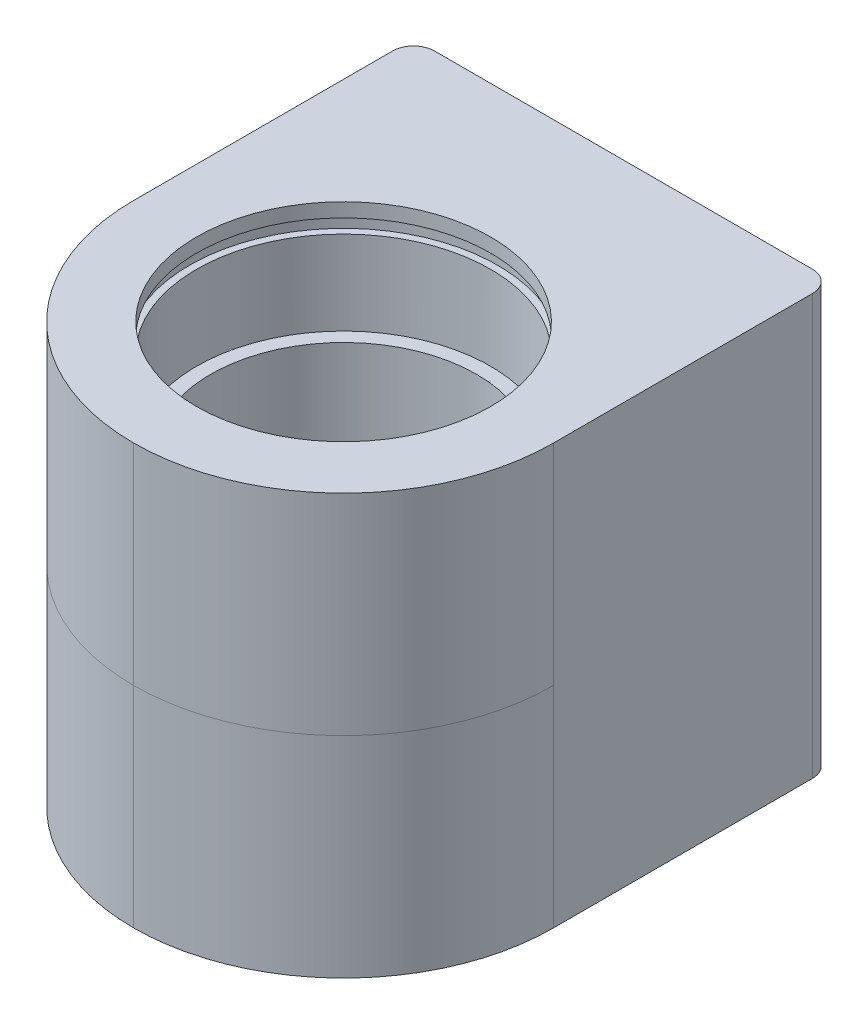
ISO-10303-21;
HEADER;
FILE_DESCRIPTION(('STEP AP214'),'2;1');
FILE_NAME('part.step','',(''),(''),'','','');
FILE_SCHEMA(('AUTOMOTIVE_DESIGN { 1 0 10303 214 1 1 1 1 }'));
ENDSEC;
DATA;
#1=APPLICATION_CONTEXT('core data for automotive mechanical design processes');
#2=APPLICATION_PROTOCOL_DEFINITION('international standard','automotive_design',2000,#1);
#3=PRODUCT_CONTEXT('',#1,'mechanical');
#4=PRODUCT('Part','Part','',(#3));
#5=PRODUCT_RELATED_PRODUCT_CATEGORY('part','',(#4));
#6=PRODUCT_DEFINITION_FORMATION('','',#4);
#7=PRODUCT_DEFINITION_CONTEXT('part definition',#1,'design');
#8=PRODUCT_DEFINITION('design','',#6,#7);
#9=PRODUCT_DEFINITION_SHAPE('','',#8);
#10=(LENGTH_UNIT() NAMED_UNIT(*) SI_UNIT(.MILLI.,.METRE.));
#11=(NAMED_UNIT(*) PLANE_ANGLE_UNIT() SI_UNIT($,.RADIAN.));
#12=(NAMED_UNIT(*) SI_UNIT($,.STERADIAN.) SOLID_ANGLE_UNIT());
#13=UNCERTAINTY_MEASURE_WITH_UNIT(LENGTH_MEASURE(1.E-05),#10,'distance_accuracy_value','');
#14=(GEOMETRIC_REPRESENTATION_CONTEXT(3) GLOBAL_UNCERTAINTY_ASSIGNED_CONTEXT((#13)) GLOBAL_UNIT_ASSIGNED_CONTEXT((#10,
#11,#12)) REPRESENTATION_CONTEXT('',''));
#15=CARTESIAN_POINT('',(0.,0.,0.));
#16=DIRECTION('',(0.,0.,1.));
#17=DIRECTION('',(1.,0.,0.));
#18=AXIS2_PLACEMENT_3D('',#15,#16,#17);
#19=CARTESIAN_POINT('',(0.,45.,40.));
#20=DIRECTION('',(0.,1.,0.));
#21=DIRECTION('',(0.,0.,1.));
#22=AXIS2_PLACEMENT_3D('',#19,#20,#21);
#23=CYLINDRICAL_SURFACE('',#22,21.);
#24=CARTESIAN_POINT('',(0.,45.,40.));
#25=DIRECTION('',(0.,1.,0.));
#26=DIRECTION('',(0.,0.,1.));
#27=AXIS2_PLACEMENT_3D('',#24,#25,#26);
#28=CIRCLE('',#27,21.);
#29=CARTESIAN_POINT('',(0.,45.,61.));
#30=VERTEX_POINT('',#29);
#31=EDGE_CURVE('E160',#30,#30,#28,.T.);
#32=ORIENTED_EDGE('',*,*,#31,.T.);
#33=EDGE_LOOP('',(#32));
#34=FACE_BOUND('',#33,.T.);
#35=CARTESIAN_POINT('',(0.,43.,40.));
#36=DIRECTION('',(0.,-1.,0.));
#37=DIRECTION('',(1.,0.,0.));
#38=AXIS2_PLACEMENT_3D('',#35,#36,#37);
#39=CIRCLE('',#38,21.);
#40=CARTESIAN_POINT('',(21.,43.,40.));
#41=VERTEX_POINT('',#40);
#42=EDGE_CURVE('E159',#41,#41,#39,.F.);
#43=ORIENTED_EDGE('',*,*,#42,.F.);
#44=EDGE_LOOP('',(#43));
#45=FACE_BOUND('',#44,.T.);
#46=ADVANCED_FACE('F42',(#34,#45),#23,.F.);
#47=CARTESIAN_POINT('',(0.,-15.,40.));
#48=DIRECTION('',(0.,-1.,0.));
#49=DIRECTION('',(0.,0.,-1.));
#50=AXIS2_PLACEMENT_3D('',#47,#48,#49);
#51=CYLINDRICAL_SURFACE('',#50,21.);
#52=CARTESIAN_POINT('',(0.,-15.,40.));
#53=DIRECTION('',(0.,-1.,0.));
#54=DIRECTION('',(0.,0.,-1.));
#55=AXIS2_PLACEMENT_3D('',#52,#53,#54);
#56=CIRCLE('',#55,21.);
#57=CARTESIAN_POINT('',(0.,-15.,19.));
#58=VERTEX_POINT('',#57);
#59=EDGE_CURVE('E185',#58,#58,#56,.T.);
#60=ORIENTED_EDGE('',*,*,#59,.T.);
#61=EDGE_LOOP('',(#60));
#62=FACE_BOUND('',#61,.T.);
#63=CARTESIAN_POINT('',(0.,-13.,40.));
#64=DIRECTION('',(0.,1.,0.));
#65=DIRECTION('',(0.,0.,1.));
#66=AXIS2_PLACEMENT_3D('',#63,#64,#65);
#67=CIRCLE('',#66,21.);
#68=CARTESIAN_POINT('',(0.,-13.,61.));
#69=VERTEX_POINT('',#68);
#70=EDGE_CURVE('E184',#69,#69,#67,.F.);
#71=ORIENTED_EDGE('',*,*,#70,.F.);
#72=EDGE_LOOP('',(#71));
#73=FACE_BOUND('',#72,.T.);
#74=ADVANCED_FACE('F303',(#62,#73),#51,.F.);
#75=CARTESIAN_POINT('',(30.,-15.,70.));
#76=DIRECTION('',(0.,1.,0.));
#77=DIRECTION('',(-1.,0.,0.));
#78=AXIS2_PLACEMENT_3D('',#75,#76,#77);
#79=PLANE('',#78);
#80=DIRECTION('',(0.,0.,-1.));
#81=VECTOR('',#80,1.);
#82=CARTESIAN_POINT('',(-30.,-15.,70.));
#83=LINE('',#82,#81);
#84=CARTESIAN_POINT('',(-30.,-15.,40.));
#85=VERTEX_POINT('',#84);
#86=CARTESIAN_POINT('',(-30.,-15.,3.));
#87=VERTEX_POINT('',#86);
#88=EDGE_CURVE('E202',#85,#87,#83,.T.);
#89=ORIENTED_EDGE('',*,*,#88,.T.);
#90=CARTESIAN_POINT('',(-27.,-15.,3.));
#91=DIRECTION('',(0.,1.,0.));
#92=DIRECTION('',(-1.,0.,0.));
#93=AXIS2_PLACEMENT_3D('',#90,#91,#92);
#94=CIRCLE('',#93,3.);
#95=CARTESIAN_POINT('',(-27.,-15.,0.));
#96=VERTEX_POINT('',#95);
#97=EDGE_CURVE('E245',#87,#96,#94,.F.);
#98=ORIENTED_EDGE('',*,*,#97,.T.);
#99=DIRECTION('',(1.,0.,0.));
#100=VECTOR('',#99,1.);
#101=CARTESIAN_POINT('',(30.,-15.,0.));
#102=LINE('',#101,#100);
#103=CARTESIAN_POINT('',(27.,-15.,0.));
#104=VERTEX_POINT('',#103);
#105=EDGE_CURVE('E196',#96,#104,#102,.T.);
#106=ORIENTED_EDGE('',*,*,#105,.T.);
#107=CARTESIAN_POINT('',(27.,-15.,3.));
#108=DIRECTION('',(0.,1.,0.));
#109=DIRECTION('',(-1.,0.,0.));
#110=AXIS2_PLACEMENT_3D('',#107,#108,#109);
#111=CIRCLE('',#110,3.);
#112=CARTESIAN_POINT('',(30.,-15.,3.));
#113=VERTEX_POINT('',#112);
#114=EDGE_CURVE('E243',#104,#113,#111,.F.);
#115=ORIENTED_EDGE('',*,*,#114,.T.);
#116=DIRECTION('',(0.,0.,-1.));
#117=VECTOR('',#116,1.);
#118=CARTESIAN_POINT('',(30.,-15.,70.));
#119=LINE('',#118,#117);
#120=CARTESIAN_POINT('',(30.,-15.,40.));
#121=VERTEX_POINT('',#120);
#122=EDGE_CURVE('E199',#121,#113,#119,.T.);
#123=ORIENTED_EDGE('',*,*,#122,.F.);
#124=CARTESIAN_POINT('',(0.,-15.,40.));
#125=DIRECTION('',(0.,1.,0.));
#126=DIRECTION('',(-1.,0.,0.));
#127=AXIS2_PLACEMENT_3D('',#124,#125,#126);
#128=CIRCLE('',#127,30.);
#129=CARTESIAN_POINT('',(0.,-15.,70.));
#130=VERTEX_POINT('',#129);
#131=EDGE_CURVE('E215',#121,#130,#128,.F.);
#132=ORIENTED_EDGE('',*,*,#131,.T.);
#133=CARTESIAN_POINT('',(0.,-15.,40.));
#134=DIRECTION('',(0.,1.,0.));
#135=DIRECTION('',(-1.,0.,0.));
#136=AXIS2_PLACEMENT_3D('',#133,#134,#135);
#137=CIRCLE('',#136,30.);
#138=EDGE_CURVE('E213',#130,#85,#137,.F.);
#139=ORIENTED_EDGE('',*,*,#138,.T.);
#140=EDGE_LOOP('',(#89,#98,#106,#115,#123,#132,#139));
#141=FACE_BOUND('',#140,.T.);
#142=ORIENTED_EDGE('',*,*,#59,.F.);
#143=EDGE_LOOP('',(#142));
#144=FACE_BOUND('',#143,.T.);
#145=ADVANCED_FACE('F265',(#141,#144),#79,.F.);
#146=CARTESIAN_POINT('',(-30.,-15.,70.));
#147=DIRECTION('',(1.,0.,0.));
#148=DIRECTION('',(0.,0.,-1.));
#149=AXIS2_PLACEMENT_3D('',#146,#147,#148);
#150=PLANE('',#149);
#151=DIRECTION('',(0.,0.,-1.));
#152=VECTOR('',#151,1.);
#153=CARTESIAN_POINT('',(-30.,45.,70.));
#154=LINE('',#153,#152);
#155=CARTESIAN_POINT('',(-30.,45.,40.));
#156=VERTEX_POINT('',#155);
#157=CARTESIAN_POINT('',(-30.,45.,3.));
#158=VERTEX_POINT('',#157);
#159=EDGE_CURVE('E173',#156,#158,#154,.T.);
#160=ORIENTED_EDGE('',*,*,#159,.T.);
#161=DIRECTION('',(0.,-1.,0.));
#162=VECTOR('',#161,1.);
#163=CARTESIAN_POINT('',(-30.,-15.,3.));
#164=LINE('',#163,#162);
#165=EDGE_CURVE('E234',#158,#87,#164,.T.);
#166=ORIENTED_EDGE('',*,*,#165,.T.);
#167=ORIENTED_EDGE('',*,*,#88,.F.);
#168=DIRECTION('',(0.,-1.,0.));
#169=VECTOR('',#168,1.);
#170=CARTESIAN_POINT('',(-30.,15.,40.));
#171=LINE('',#170,#169);
#172=CARTESIAN_POINT('',(-30.,15.,40.));
#173=VERTEX_POINT('',#172);
#174=EDGE_CURVE('E217',#85,#173,#171,.F.);
#175=ORIENTED_EDGE('',*,*,#174,.T.);
#176=DIRECTION('',(0.,1.,0.));
#177=VECTOR('',#176,1.);
#178=CARTESIAN_POINT('',(-30.,45.,40.));
#179=LINE('',#178,#177);
#180=EDGE_CURVE('E232',#173,#156,#179,.T.);
#181=ORIENTED_EDGE('',*,*,#180,.T.);
#182=EDGE_LOOP('',(#160,#166,#167,#175,#181));
#183=FACE_BOUND('',#182,.T.);
#184=ADVANCED_FACE('F259',(#183),#150,.F.);
#185=CARTESIAN_POINT('',(30.,-15.,70.));
#186=DIRECTION('',(-1.,0.,0.));
#187=DIRECTION('',(0.,0.,1.));
#188=AXIS2_PLACEMENT_3D('',#185,#186,#187);
#189=PLANE('',#188);
#190=ORIENTED_EDGE('',*,*,#122,.T.);
#191=DIRECTION('',(0.,1.,0.));
#192=VECTOR('',#191,1.);
#193=CARTESIAN_POINT('',(30.,-15.,3.));
#194=LINE('',#193,#192);
#195=CARTESIAN_POINT('',(30.,45.,3.));
#196=VERTEX_POINT('',#195);
#197=EDGE_CURVE('E11',#113,#196,#194,.T.);
#198=ORIENTED_EDGE('',*,*,#197,.T.);
#199=DIRECTION('',(0.,0.,-1.));
#200=VECTOR('',#199,1.);
#201=CARTESIAN_POINT('',(30.,45.,70.));
#202=LINE('',#201,#200);
#203=CARTESIAN_POINT('',(30.,45.,40.));
#204=VERTEX_POINT('',#203);
#205=EDGE_CURVE('E176',#204,#196,#202,.T.);
#206=ORIENTED_EDGE('',*,*,#205,.F.);
#207=DIRECTION('',(0.,-1.,0.));
#208=VECTOR('',#207,1.);
#209=CARTESIAN_POINT('',(30.,15.,40.));
#210=LINE('',#209,#208);
#211=CARTESIAN_POINT('',(30.,15.,40.));
#212=VERTEX_POINT('',#211);
#213=EDGE_CURVE('E219',#204,#212,#210,.T.);
#214=ORIENTED_EDGE('',*,*,#213,.T.);
#215=DIRECTION('',(0.,1.,0.));
#216=VECTOR('',#215,1.);
#217=CARTESIAN_POINT('',(30.,-15.,40.));
#218=LINE('',#217,#216);
#219=EDGE_CURVE('E210',#212,#121,#218,.F.);
#220=ORIENTED_EDGE('',*,*,#219,.T.);
#221=EDGE_LOOP('',(#190,#198,#206,#214,#220));
#222=FACE_BOUND('',#221,.T.);
#223=ADVANCED_FACE('F272',(#222),#189,.F.);
#224=CARTESIAN_POINT('',(0.,0.,0.));
#225=DIRECTION('',(0.,0.,1.));
#226=DIRECTION('',(1.,0.,0.));
#227=AXIS2_PLACEMENT_3D('',#224,#225,#226);
#228=PLANE('',#227);
#229=CARTESIAN_POINT('',(20.,35.,0.));
#230=DIRECTION('',(0.,0.,-1.));
#231=DIRECTION('',(-1.,0.,0.));
#232=AXIS2_PLACEMENT_3D('',#229,#230,#231);
#233=CIRCLE('',#232,2.49999999999999);
#234=CARTESIAN_POINT('',(17.5,35.,0.));
#235=VERTEX_POINT('',#234);
#236=EDGE_CURVE('E131',#235,#235,#233,.T.);
#237=ORIENTED_EDGE('',*,*,#236,.F.);
#238=EDGE_LOOP('',(#237));
#239=FACE_BOUND('',#238,.T.);
#240=CARTESIAN_POINT('',(-20.,35.,0.));
#241=DIRECTION('',(0.,0.,-1.));
#242=DIRECTION('',(-1.,0.,0.));
#243=AXIS2_PLACEMENT_3D('',#240,#241,#242);
#244=CIRCLE('',#243,2.49999999999999);
#245=CARTESIAN_POINT('',(-22.5,35.,0.));
#246=VERTEX_POINT('',#245);
#247=EDGE_CURVE('E130',#246,#246,#244,.T.);
#248=ORIENTED_EDGE('',*,*,#247,.F.);
#249=EDGE_LOOP('',(#248));
#250=FACE_BOUND('',#249,.T.);
#251=CARTESIAN_POINT('',(20.,-5.,0.));
#252=DIRECTION('',(0.,0.,-1.));
#253=DIRECTION('',(-1.,0.,0.));
#254=AXIS2_PLACEMENT_3D('',#251,#252,#253);
#255=CIRCLE('',#254,2.49999999999999);
#256=CARTESIAN_POINT('',(17.5,-5.,0.));
#257=VERTEX_POINT('',#256);
#258=EDGE_CURVE('E141',#257,#257,#255,.T.);
#259=ORIENTED_EDGE('',*,*,#258,.F.);
#260=EDGE_LOOP('',(#259));
#261=FACE_BOUND('',#260,.T.);
#262=CARTESIAN_POINT('',(-20.,-5.,0.));
#263=DIRECTION('',(0.,0.,-1.));
#264=DIRECTION('',(-1.,0.,0.));
#265=AXIS2_PLACEMENT_3D('',#262,#263,#264);
#266=CIRCLE('',#265,2.49999999999999);
#267=CARTESIAN_POINT('',(-22.5,-5.,0.));
#268=VERTEX_POINT('',#267);
#269=EDGE_CURVE('E147',#268,#268,#266,.T.);
#270=ORIENTED_EDGE('',*,*,#269,.F.);
#271=EDGE_LOOP('',(#270));
#272=FACE_BOUND('',#271,.T.);
#273=ORIENTED_EDGE('',*,*,#105,.F.);
#274=DIRECTION('',(0.,-1.,0.));
#275=VECTOR('',#274,1.);
#276=CARTESIAN_POINT('',(-27.,0.,0.));
#277=LINE('',#276,#275);
#278=CARTESIAN_POINT('',(-27.,45.,0.));
#279=VERTEX_POINT('',#278);
#280=EDGE_CURVE('E249',#96,#279,#277,.F.);
#281=ORIENTED_EDGE('',*,*,#280,.T.);
#282=DIRECTION('',(1.,0.,0.));
#283=VECTOR('',#282,1.);
#284=CARTESIAN_POINT('',(30.,45.,0.));
#285=LINE('',#284,#283);
#286=CARTESIAN_POINT('',(27.,45.,0.));
#287=VERTEX_POINT('',#286);
#288=EDGE_CURVE('E171',#279,#287,#285,.T.);
#289=ORIENTED_EDGE('',*,*,#288,.T.);
#290=DIRECTION('',(0.,1.,0.));
#291=VECTOR('',#290,1.);
#292=CARTESIAN_POINT('',(27.,0.,0.));
#293=LINE('',#292,#291);
#294=EDGE_CURVE('E247',#287,#104,#293,.F.);
#295=ORIENTED_EDGE('',*,*,#294,.T.);
#296=EDGE_LOOP('',(#273,#281,#289,#295));
#297=FACE_BOUND('',#296,.T.);
#298=ADVANCED_FACE('F269',(#239,#250,#261,#272,#297),#228,.F.);
#299=CARTESIAN_POINT('',(0.,0.,40.));
#300=DIRECTION('',(0.,1.,0.));
#301=DIRECTION('',(0.,0.,1.));
#302=AXIS2_PLACEMENT_3D('',#299,#300,#301);
#303=CYLINDRICAL_SURFACE('',#302,30.);
#304=ORIENTED_EDGE('',*,*,#174,.F.);
#305=ORIENTED_EDGE('',*,*,#138,.F.);
#306=DIRECTION('',(0.,-1.,0.));
#307=VECTOR('',#306,1.);
#308=CARTESIAN_POINT('',(0.,-15.,70.));
#309=LINE('',#308,#307);
#310=CARTESIAN_POINT('',(0.,15.,70.));
#311=VERTEX_POINT('',#310);
#312=EDGE_CURVE('E195',#311,#130,#309,.T.);
#313=ORIENTED_EDGE('',*,*,#312,.F.);
#314=CARTESIAN_POINT('',(0.,15.,40.));
#315=DIRECTION('',(0.,-1.,0.));
#316=DIRECTION('',(1.,0.,0.));
#317=AXIS2_PLACEMENT_3D('',#314,#315,#316);
#318=CIRCLE('',#317,30.);
#319=EDGE_CURVE('E205',#173,#311,#318,.F.);
#320=ORIENTED_EDGE('',*,*,#319,.F.);
#321=EDGE_LOOP('',(#304,#305,#313,#320));
#322=FACE_BOUND('',#321,.T.);
#323=ADVANCED_FACE('F282',(#322),#303,.T.);
#324=CARTESIAN_POINT('',(0.,0.,40.));
#325=DIRECTION('',(0.,-1.,0.));
#326=DIRECTION('',(0.,0.,-1.));
#327=AXIS2_PLACEMENT_3D('',#324,#325,#326);
#328=CYLINDRICAL_SURFACE('',#327,30.);
#329=ORIENTED_EDGE('',*,*,#131,.F.);
#330=ORIENTED_EDGE('',*,*,#219,.F.);
#331=CARTESIAN_POINT('',(0.,15.,40.));
#332=DIRECTION('',(0.,-1.,0.));
#333=DIRECTION('',(1.,0.,0.));
#334=AXIS2_PLACEMENT_3D('',#331,#332,#333);
#335=CIRCLE('',#334,30.);
#336=EDGE_CURVE('E208',#311,#212,#335,.F.);
#337=ORIENTED_EDGE('',*,*,#336,.F.);
#338=ORIENTED_EDGE('',*,*,#312,.T.);
#339=EDGE_LOOP('',(#329,#330,#337,#338));
#340=FACE_BOUND('',#339,.T.);
#341=ADVANCED_FACE('F278',(#340),#328,.T.);
#342=CARTESIAN_POINT('',(0.,-15.,40.));
#343=DIRECTION('',(0.,-1.,0.));
#344=DIRECTION('',(0.,0.,-1.));
#345=AXIS2_PLACEMENT_3D('',#342,#343,#344);
#346=CYLINDRICAL_SURFACE('',#345,19.);
#347=CARTESIAN_POINT('',(0.,0.999999999999999,40.));
#348=DIRECTION('',(0.,-1.,0.));
#349=DIRECTION('',(0.,0.,-1.));
#350=AXIS2_PLACEMENT_3D('',#347,#348,#349);
#351=CIRCLE('',#350,19.);
#352=CARTESIAN_POINT('',(0.,0.999999999999999,21.));
#353=VERTEX_POINT('',#352);
#354=EDGE_CURVE('E192',#353,#353,#351,.T.);
#355=ORIENTED_EDGE('',*,*,#354,.T.);
#356=EDGE_LOOP('',(#355));
#357=FACE_BOUND('',#356,.T.);
#358=CARTESIAN_POINT('',(0.,29.,40.));
#359=DIRECTION('',(0.,1.,0.));
#360=DIRECTION('',(0.,0.,1.));
#361=AXIS2_PLACEMENT_3D('',#358,#359,#360);
#362=CIRCLE('',#361,19.);
#363=CARTESIAN_POINT('',(0.,29.,59.));
#364=VERTEX_POINT('',#363);
#365=EDGE_CURVE('E167',#364,#364,#362,.T.);
#366=ORIENTED_EDGE('',*,*,#365,.T.);
#367=EDGE_LOOP('',(#366));
#368=FACE_BOUND('',#367,.T.);
#369=ADVANCED_FACE('F394',(#357,#368),#346,.F.);
#370=CARTESIAN_POINT('',(19.,0.999999999999999,40.));
#371=DIRECTION('',(0.,1.,0.));
#372=DIRECTION('',(0.,0.,1.));
#373=AXIS2_PLACEMENT_3D('',#370,#371,#372);
#374=PLANE('',#373);
#375=ORIENTED_EDGE('',*,*,#354,.F.);
#376=EDGE_LOOP('',(#375));
#377=FACE_BOUND('',#376,.T.);
#378=CARTESIAN_POINT('',(0.,0.999999999999999,40.));
#379=DIRECTION('',(0.,-1.,0.));
#380=DIRECTION('',(0.,0.,-1.));
#381=AXIS2_PLACEMENT_3D('',#378,#379,#380);
#382=CIRCLE('',#381,21.);
#383=CARTESIAN_POINT('',(0.,0.999999999999999,19.));
#384=VERTEX_POINT('',#383);
#385=EDGE_CURVE('E188',#384,#384,#382,.T.);
#386=ORIENTED_EDGE('',*,*,#385,.T.);
#387=EDGE_LOOP('',(#386));
#388=FACE_BOUND('',#387,.T.);
#389=ADVANCED_FACE('F405',(#377,#388),#374,.F.);
#390=CARTESIAN_POINT('',(0.,-11.,40.));
#391=DIRECTION('',(0.,1.,0.));
#392=DIRECTION('',(0.,0.,1.));
#393=AXIS2_PLACEMENT_3D('',#390,#391,#392);
#394=CIRCLE('',#393,21.);
#395=CARTESIAN_POINT('',(0.,-11.,61.));
#396=VERTEX_POINT('',#395);
#397=EDGE_CURVE('E189',#396,#396,#394,.F.);
#398=ORIENTED_EDGE('',*,*,#397,.T.);
#399=EDGE_LOOP('',(#398));
#400=FACE_BOUND('',#399,.T.);
#401=ORIENTED_EDGE('',*,*,#385,.F.);
#402=EDGE_LOOP('',(#401));
#403=FACE_BOUND('',#402,.T.);
#404=ADVANCED_FACE('F311',(#400,#403),#51,.F.);
#405=CARTESIAN_POINT('',(0.,-11.,40.));
#406=DIRECTION('',(0.,1.,0.));
#407=DIRECTION('',(0.,0.,1.));
#408=AXIS2_PLACEMENT_3D('',#405,#406,#407);
#409=PLANE('',#408);
#410=CARTESIAN_POINT('',(0.,-11.,40.));
#411=DIRECTION('',(0.,1.,0.));
#412=DIRECTION('',(0.,0.,1.));
#413=AXIS2_PLACEMENT_3D('',#410,#411,#412);
#414=CIRCLE('',#413,22.);
#415=CARTESIAN_POINT('',(0.,-11.,62.));
#416=VERTEX_POINT('',#415);
#417=EDGE_CURVE('E181',#416,#416,#414,.T.);
#418=ORIENTED_EDGE('',*,*,#417,.F.);
#419=EDGE_LOOP('',(#418));
#420=FACE_BOUND('',#419,.T.);
#421=ORIENTED_EDGE('',*,*,#397,.F.);
#422=EDGE_LOOP('',(#421));
#423=FACE_BOUND('',#422,.T.);
#424=ADVANCED_FACE('F418',(#420,#423),#409,.F.);
#425=CARTESIAN_POINT('',(0.,-13.,40.));
#426=DIRECTION('',(0.,1.,0.));
#427=DIRECTION('',(0.,0.,1.));
#428=AXIS2_PLACEMENT_3D('',#425,#426,#427);
#429=PLANE('',#428);
#430=CARTESIAN_POINT('',(0.,-13.,40.));
#431=DIRECTION('',(0.,1.,0.));
#432=DIRECTION('',(0.,0.,1.));
#433=AXIS2_PLACEMENT_3D('',#430,#431,#432);
#434=CIRCLE('',#433,22.);
#435=CARTESIAN_POINT('',(0.,-13.,62.));
#436=VERTEX_POINT('',#435);
#437=EDGE_CURVE('E178',#436,#436,#434,.T.);
#438=ORIENTED_EDGE('',*,*,#437,.T.);
#439=EDGE_LOOP('',(#438));
#440=FACE_BOUND('',#439,.T.);
#441=ORIENTED_EDGE('',*,*,#70,.T.);
#442=EDGE_LOOP('',(#441));
#443=FACE_BOUND('',#442,.T.);
#444=ADVANCED_FACE('F423',(#440,#443),#429,.T.);
#445=CARTESIAN_POINT('',(0.,-11.,40.));
#446=DIRECTION('',(0.,-1.,0.));
#447=DIRECTION('',(0.,0.,-1.));
#448=AXIS2_PLACEMENT_3D('',#445,#446,#447);
#449=CYLINDRICAL_SURFACE('',#448,22.);
#450=ORIENTED_EDGE('',*,*,#417,.T.);
#451=EDGE_LOOP('',(#450));
#452=FACE_BOUND('',#451,.T.);
#453=ORIENTED_EDGE('',*,*,#437,.F.);
#454=EDGE_LOOP('',(#453));
#455=FACE_BOUND('',#454,.T.);
#456=ADVANCED_FACE('F427',(#452,#455),#449,.F.);
#457=CARTESIAN_POINT('',(30.,45.,70.));
#458=DIRECTION('',(0.,1.,0.));
#459=DIRECTION('',(-1.,0.,0.));
#460=AXIS2_PLACEMENT_3D('',#457,#458,#459);
#461=PLANE('',#460);
#462=ORIENTED_EDGE('',*,*,#31,.F.);
#463=EDGE_LOOP('',(#462));
#464=FACE_BOUND('',#463,.T.);
#465=ORIENTED_EDGE('',*,*,#288,.F.);
#466=CARTESIAN_POINT('',(-27.,45.,3.));
#467=DIRECTION('',(0.,1.,0.));
#468=DIRECTION('',(-1.,0.,0.));
#469=AXIS2_PLACEMENT_3D('',#466,#467,#468);
#470=CIRCLE('',#469,3.);
#471=EDGE_CURVE('E50',#279,#158,#470,.T.);
#472=ORIENTED_EDGE('',*,*,#471,.T.);
#473=ORIENTED_EDGE('',*,*,#159,.F.);
#474=CARTESIAN_POINT('',(0.,45.,40.));
#475=DIRECTION('',(0.,1.,0.));
#476=DIRECTION('',(-1.,0.,0.));
#477=AXIS2_PLACEMENT_3D('',#474,#475,#476);
#478=CIRCLE('',#477,30.);
#479=CARTESIAN_POINT('',(0.,45.,70.));
#480=VERTEX_POINT('',#479);
#481=EDGE_CURVE('E228',#156,#480,#478,.T.);
#482=ORIENTED_EDGE('',*,*,#481,.T.);
#483=CARTESIAN_POINT('',(0.,45.,40.));
#484=DIRECTION('',(0.,1.,0.));
#485=DIRECTION('',(-1.,0.,0.));
#486=AXIS2_PLACEMENT_3D('',#483,#484,#485);
#487=CIRCLE('',#486,30.);
#488=EDGE_CURVE('E230',#480,#204,#487,.T.);
#489=ORIENTED_EDGE('',*,*,#488,.T.);
#490=ORIENTED_EDGE('',*,*,#205,.T.);
#491=CARTESIAN_POINT('',(27.,45.,3.));
#492=DIRECTION('',(0.,1.,0.));
#493=DIRECTION('',(-1.,0.,0.));
#494=AXIS2_PLACEMENT_3D('',#491,#492,#493);
#495=CIRCLE('',#494,3.);
#496=EDGE_CURVE('E57',#196,#287,#495,.T.);
#497=ORIENTED_EDGE('',*,*,#496,.T.);
#498=EDGE_LOOP('',(#465,#472,#473,#482,#489,#490,#497));
#499=FACE_BOUND('',#498,.T.);
#500=ADVANCED_FACE('F253',(#464,#499),#461,.T.);
#501=CARTESIAN_POINT('',(0.,-15.,40.));
#502=DIRECTION('',(0.,-1.,0.));
#503=DIRECTION('',(0.,0.,-1.));
#504=AXIS2_PLACEMENT_3D('',#501,#502,#503);
#505=CYLINDRICAL_SURFACE('',#504,30.);
#506=DIRECTION('',(0.,1.,0.));
#507=VECTOR('',#506,1.);
#508=CARTESIAN_POINT('',(0.,15.,70.));
#509=LINE('',#508,#507);
#510=EDGE_CURVE('E170',#480,#311,#509,.F.);
#511=ORIENTED_EDGE('',*,*,#510,.F.);
#512=ORIENTED_EDGE('',*,*,#481,.F.);
#513=ORIENTED_EDGE('',*,*,#180,.F.);
#514=ORIENTED_EDGE('',*,*,#319,.T.);
#515=EDGE_LOOP('',(#511,#512,#513,#514));
#516=FACE_BOUND('',#515,.T.);
#517=ADVANCED_FACE('F286',(#516),#505,.T.);
#518=CARTESIAN_POINT('',(0.,-15.,40.));
#519=DIRECTION('',(0.,1.,0.));
#520=DIRECTION('',(0.,0.,1.));
#521=AXIS2_PLACEMENT_3D('',#518,#519,#520);
#522=CYLINDRICAL_SURFACE('',#521,30.);
#523=ORIENTED_EDGE('',*,*,#488,.F.);
#524=ORIENTED_EDGE('',*,*,#510,.T.);
#525=ORIENTED_EDGE('',*,*,#336,.T.);
#526=ORIENTED_EDGE('',*,*,#213,.F.);
#527=EDGE_LOOP('',(#523,#524,#525,#526));
#528=FACE_BOUND('',#527,.T.);
#529=ADVANCED_FACE('F289',(#528),#522,.T.);
#530=CARTESIAN_POINT('',(19.,29.,40.));
#531=DIRECTION('',(0.,-1.,0.));
#532=DIRECTION('',(0.,0.,-1.));
#533=AXIS2_PLACEMENT_3D('',#530,#531,#532);
#534=PLANE('',#533);
#535=ORIENTED_EDGE('',*,*,#365,.F.);
#536=EDGE_LOOP('',(#535));
#537=FACE_BOUND('',#536,.T.);
#538=CARTESIAN_POINT('',(0.,29.,40.));
#539=DIRECTION('',(0.,1.,0.));
#540=DIRECTION('',(0.,0.,1.));
#541=AXIS2_PLACEMENT_3D('',#538,#539,#540);
#542=CIRCLE('',#541,21.);
#543=CARTESIAN_POINT('',(0.,29.,61.));
#544=VERTEX_POINT('',#543);
#545=EDGE_CURVE('E163',#544,#544,#542,.T.);
#546=ORIENTED_EDGE('',*,*,#545,.T.);
#547=EDGE_LOOP('',(#546));
#548=FACE_BOUND('',#547,.T.);
#549=ADVANCED_FACE('F291',(#537,#548),#534,.F.);
#550=CARTESIAN_POINT('',(0.,41.,40.));
#551=DIRECTION('',(0.,-1.,0.));
#552=DIRECTION('',(1.,0.,0.));
#553=AXIS2_PLACEMENT_3D('',#550,#551,#552);
#554=CIRCLE('',#553,21.);
#555=CARTESIAN_POINT('',(21.,41.,40.));
#556=VERTEX_POINT('',#555);
#557=EDGE_CURVE('E164',#556,#556,#554,.F.);
#558=ORIENTED_EDGE('',*,*,#557,.T.);
#559=EDGE_LOOP('',(#558));
#560=FACE_BOUND('',#559,.T.);
#561=ORIENTED_EDGE('',*,*,#545,.F.);
#562=EDGE_LOOP('',(#561));
#563=FACE_BOUND('',#562,.T.);
#564=ADVANCED_FACE('F297',(#560,#563),#23,.F.);
#565=CARTESIAN_POINT('',(0.,41.,40.));
#566=DIRECTION('',(0.,-1.,0.));
#567=DIRECTION('',(0.,0.,1.));
#568=AXIS2_PLACEMENT_3D('',#565,#566,#567);
#569=PLANE('',#568);
#570=CARTESIAN_POINT('',(0.,41.,40.));
#571=DIRECTION('',(0.,1.,0.));
#572=DIRECTION('',(0.,0.,1.));
#573=AXIS2_PLACEMENT_3D('',#570,#571,#572);
#574=CIRCLE('',#573,22.);
#575=CARTESIAN_POINT('',(0.,41.,62.));
#576=VERTEX_POINT('',#575);
#577=EDGE_CURVE('E156',#576,#576,#574,.T.);
#578=ORIENTED_EDGE('',*,*,#577,.T.);
#579=EDGE_LOOP('',(#578));
#580=FACE_BOUND('',#579,.T.);
#581=ORIENTED_EDGE('',*,*,#557,.F.);
#582=EDGE_LOOP('',(#581));
#583=FACE_BOUND('',#582,.T.);
#584=ADVANCED_FACE('F315',(#580,#583),#569,.F.);
#585=CARTESIAN_POINT('',(0.,43.,40.));
#586=DIRECTION('',(0.,-1.,0.));
#587=DIRECTION('',(0.,0.,1.));
#588=AXIS2_PLACEMENT_3D('',#585,#586,#587);
#589=PLANE('',#588);
#590=CARTESIAN_POINT('',(0.,43.,40.));
#591=DIRECTION('',(0.,1.,0.));
#592=DIRECTION('',(0.,0.,1.));
#593=AXIS2_PLACEMENT_3D('',#590,#591,#592);
#594=CIRCLE('',#593,22.);
#595=CARTESIAN_POINT('',(0.,43.,62.));
#596=VERTEX_POINT('',#595);
#597=EDGE_CURVE('E153',#596,#596,#594,.T.);
#598=ORIENTED_EDGE('',*,*,#597,.F.);
#599=EDGE_LOOP('',(#598));
#600=FACE_BOUND('',#599,.T.);
#601=ORIENTED_EDGE('',*,*,#42,.T.);
#602=EDGE_LOOP('',(#601));
#603=FACE_BOUND('',#602,.T.);
#604=ADVANCED_FACE('F320',(#600,#603),#589,.T.);
#605=CARTESIAN_POINT('',(0.,41.,40.));
#606=DIRECTION('',(0.,1.,0.));
#607=DIRECTION('',(-1.,0.,0.));
#608=AXIS2_PLACEMENT_3D('',#605,#606,#607);
#609=CYLINDRICAL_SURFACE('',#608,22.);
#610=ORIENTED_EDGE('',*,*,#577,.F.);
#611=EDGE_LOOP('',(#610));
#612=FACE_BOUND('',#611,.T.);
#613=ORIENTED_EDGE('',*,*,#597,.T.);
#614=EDGE_LOOP('',(#613));
#615=FACE_BOUND('',#614,.T.);
#616=ADVANCED_FACE('F331',(#612,#615),#609,.F.);
#617=CARTESIAN_POINT('',(-20.,-5.,20.));
#618=DIRECTION('',(0.,0.,-1.));
#619=DIRECTION('',(-1.,0.,0.));
#620=AXIS2_PLACEMENT_3D('',#617,#618,#619);
#621=CONICAL_SURFACE('',#620,2.5,1.02974425867665);
#622=CARTESIAN_POINT('',(-20.,-5.,21.5021515475689));
#623=VERTEX_POINT('',#622);
#624=VERTEX_LOOP('',#623);
#625=FACE_BOUND('',#624,.T.);
#626=CARTESIAN_POINT('',(-20.,-5.,20.));
#627=DIRECTION('',(0.,0.,-1.));
#628=DIRECTION('',(-1.,0.,0.));
#629=AXIS2_PLACEMENT_3D('',#626,#627,#628);
#630=CIRCLE('',#629,2.5);
#631=CARTESIAN_POINT('',(-22.5,-5.,20.));
#632=VERTEX_POINT('',#631);
#633=EDGE_CURVE('E150',#632,#632,#630,.T.);
#634=ORIENTED_EDGE('',*,*,#633,.T.);
#635=EDGE_LOOP('',(#634));
#636=FACE_BOUND('',#635,.T.);
#637=ADVANCED_FACE('F336',(#625,#636),#621,.F.);
#638=CARTESIAN_POINT('',(-20.,-5.,0.));
#639=DIRECTION('',(0.,0.,-1.));
#640=DIRECTION('',(-1.,0.,0.));
#641=AXIS2_PLACEMENT_3D('',#638,#639,#640);
#642=CYLINDRICAL_SURFACE('',#641,2.49999999999999);
#643=ORIENTED_EDGE('',*,*,#633,.F.);
#644=EDGE_LOOP('',(#643));
#645=FACE_BOUND('',#644,.T.);
#646=ORIENTED_EDGE('',*,*,#269,.T.);
#647=EDGE_LOOP('',(#646));
#648=FACE_BOUND('',#647,.T.);
#649=ADVANCED_FACE('F341',(#645,#648),#642,.F.);
#650=CARTESIAN_POINT('',(20.,-5.,20.));
#651=DIRECTION('',(0.,0.,-1.));
#652=DIRECTION('',(-1.,0.,0.));
#653=AXIS2_PLACEMENT_3D('',#650,#651,#652);
#654=CONICAL_SURFACE('',#653,2.5,1.02974425867665);
#655=CARTESIAN_POINT('',(20.,-5.,21.5021515475689));
#656=VERTEX_POINT('',#655);
#657=VERTEX_LOOP('',#656);
#658=FACE_BOUND('',#657,.T.);
#659=CARTESIAN_POINT('',(20.,-5.,20.));
#660=DIRECTION('',(0.,0.,-1.));
#661=DIRECTION('',(-1.,0.,0.));
#662=AXIS2_PLACEMENT_3D('',#659,#660,#661);
#663=CIRCLE('',#662,2.5);
#664=CARTESIAN_POINT('',(17.5,-5.,20.));
#665=VERTEX_POINT('',#664);
#666=EDGE_CURVE('E144',#665,#665,#663,.T.);
#667=ORIENTED_EDGE('',*,*,#666,.T.);
#668=EDGE_LOOP('',(#667));
#669=FACE_BOUND('',#668,.T.);
#670=ADVANCED_FACE('F351',(#658,#669),#654,.F.);
#671=CARTESIAN_POINT('',(20.,-5.,0.));
#672=DIRECTION('',(0.,0.,-1.));
#673=DIRECTION('',(-1.,0.,0.));
#674=AXIS2_PLACEMENT_3D('',#671,#672,#673);
#675=CYLINDRICAL_SURFACE('',#674,2.49999999999999);
#676=ORIENTED_EDGE('',*,*,#666,.F.);
#677=EDGE_LOOP('',(#676));
#678=FACE_BOUND('',#677,.T.);
#679=ORIENTED_EDGE('',*,*,#258,.T.);
#680=EDGE_LOOP('',(#679));
#681=FACE_BOUND('',#680,.T.);
#682=ADVANCED_FACE('F358',(#678,#681),#675,.F.);
#683=CARTESIAN_POINT('',(-20.,35.,20.));
#684=DIRECTION('',(0.,0.,-1.));
#685=DIRECTION('',(-1.,0.,0.));
#686=AXIS2_PLACEMENT_3D('',#683,#684,#685);
#687=CONICAL_SURFACE('',#686,2.5,1.02974425867665);
#688=CARTESIAN_POINT('',(-20.,35.,21.5021515475689));
#689=VERTEX_POINT('',#688);
#690=VERTEX_LOOP('',#689);
#691=FACE_BOUND('',#690,.T.);
#692=CARTESIAN_POINT('',(-20.,35.,20.));
#693=DIRECTION('',(0.,0.,-1.));
#694=DIRECTION('',(-1.,0.,0.));
#695=AXIS2_PLACEMENT_3D('',#692,#693,#694);
#696=CIRCLE('',#695,2.5);
#697=CARTESIAN_POINT('',(-22.5,35.,20.));
#698=VERTEX_POINT('',#697);
#699=EDGE_CURVE('E134',#698,#698,#696,.T.);
#700=ORIENTED_EDGE('',*,*,#699,.T.);
#701=EDGE_LOOP('',(#700));
#702=FACE_BOUND('',#701,.T.);
#703=ADVANCED_FACE('F362',(#691,#702),#687,.F.);
#704=CARTESIAN_POINT('',(-20.,35.,0.));
#705=DIRECTION('',(0.,0.,-1.));
#706=DIRECTION('',(-1.,0.,0.));
#707=AXIS2_PLACEMENT_3D('',#704,#705,#706);
#708=CYLINDRICAL_SURFACE('',#707,2.49999999999999);
#709=ORIENTED_EDGE('',*,*,#699,.F.);
#710=EDGE_LOOP('',(#709));
#711=FACE_BOUND('',#710,.T.);
#712=ORIENTED_EDGE('',*,*,#247,.T.);
#713=EDGE_LOOP('',(#712));
#714=FACE_BOUND('',#713,.T.);
#715=ADVANCED_FACE('F124',(#711,#714),#708,.F.);
#716=CARTESIAN_POINT('',(20.,35.,20.));
#717=DIRECTION('',(0.,0.,-1.));
#718=DIRECTION('',(-1.,0.,0.));
#719=AXIS2_PLACEMENT_3D('',#716,#717,#718);
#720=CONICAL_SURFACE('',#719,2.5,1.02974425867665);
#721=CARTESIAN_POINT('',(20.,35.,21.5021515475689));
#722=VERTEX_POINT('',#721);
#723=VERTEX_LOOP('',#722);
#724=FACE_BOUND('',#723,.T.);
#725=CARTESIAN_POINT('',(20.,35.,20.));
#726=DIRECTION('',(0.,0.,-1.));
#727=DIRECTION('',(-1.,0.,0.));
#728=AXIS2_PLACEMENT_3D('',#725,#726,#727);
#729=CIRCLE('',#728,2.5);
#730=CARTESIAN_POINT('',(17.5,35.,20.));
#731=VERTEX_POINT('',#730);
#732=EDGE_CURVE('E128',#731,#731,#729,.T.);
#733=ORIENTED_EDGE('',*,*,#732,.T.);
#734=EDGE_LOOP('',(#733));
#735=FACE_BOUND('',#734,.T.);
#736=ADVANCED_FACE('F120',(#724,#735),#720,.F.);
#737=CARTESIAN_POINT('',(20.,35.,0.));
#738=DIRECTION('',(0.,0.,-1.));
#739=DIRECTION('',(-1.,0.,0.));
#740=AXIS2_PLACEMENT_3D('',#737,#738,#739);
#741=CYLINDRICAL_SURFACE('',#740,2.49999999999999);
#742=ORIENTED_EDGE('',*,*,#732,.F.);
#743=EDGE_LOOP('',(#742));
#744=FACE_BOUND('',#743,.T.);
#745=ORIENTED_EDGE('',*,*,#236,.T.);
#746=EDGE_LOOP('',(#745));
#747=FACE_BOUND('',#746,.T.);
#748=ADVANCED_FACE('F123',(#744,#747),#741,.F.);
#749=CARTESIAN_POINT('',(-27.,-15.,3.));
#750=DIRECTION('',(0.,-1.,0.));
#751=DIRECTION('',(0.,0.,-1.));
#752=AXIS2_PLACEMENT_3D('',#749,#750,#751);
#753=CYLINDRICAL_SURFACE('',#752,3.);
#754=ORIENTED_EDGE('',*,*,#471,.F.);
#755=ORIENTED_EDGE('',*,*,#280,.F.);
#756=ORIENTED_EDGE('',*,*,#97,.F.);
#757=ORIENTED_EDGE('',*,*,#165,.F.);
#758=EDGE_LOOP('',(#754,#755,#756,#757));
#759=FACE_BOUND('',#758,.T.);
#760=ADVANCED_FACE('F262',(#759),#753,.T.);
#761=CARTESIAN_POINT('',(27.,-15.,3.));
#762=DIRECTION('',(0.,1.,0.));
#763=DIRECTION('',(0.,0.,1.));
#764=AXIS2_PLACEMENT_3D('',#761,#762,#763);
#765=CYLINDRICAL_SURFACE('',#764,3.);
#766=ORIENTED_EDGE('',*,*,#114,.F.);
#767=ORIENTED_EDGE('',*,*,#294,.F.);
#768=ORIENTED_EDGE('',*,*,#496,.F.);
#769=ORIENTED_EDGE('',*,*,#197,.F.);
#770=EDGE_LOOP('',(#766,#767,#768,#769));
#771=FACE_BOUND('',#770,.T.);
#772=ADVANCED_FACE('F44',(#771),#765,.T.);
#773=CLOSED_SHELL('',(#46,#74,#145,#184,#223,#298,#323,#341,#369,#389,#404,#424,#444,#456,#500,
#517,#529,#549,#564,#584,#604,#616,#637,#649,#670,#682,#703,#715,#736,#748,#760,#772));
#774=MANIFOLD_SOLID_BREP('B2',#773);
#775=ADVANCED_BREP_SHAPE_REPRESENTATION('',(#18,#774),#14);
#776=SHAPE_DEFINITION_REPRESENTATION(#9,#775);
ENDSEC;
END-ISO-10303-21;
